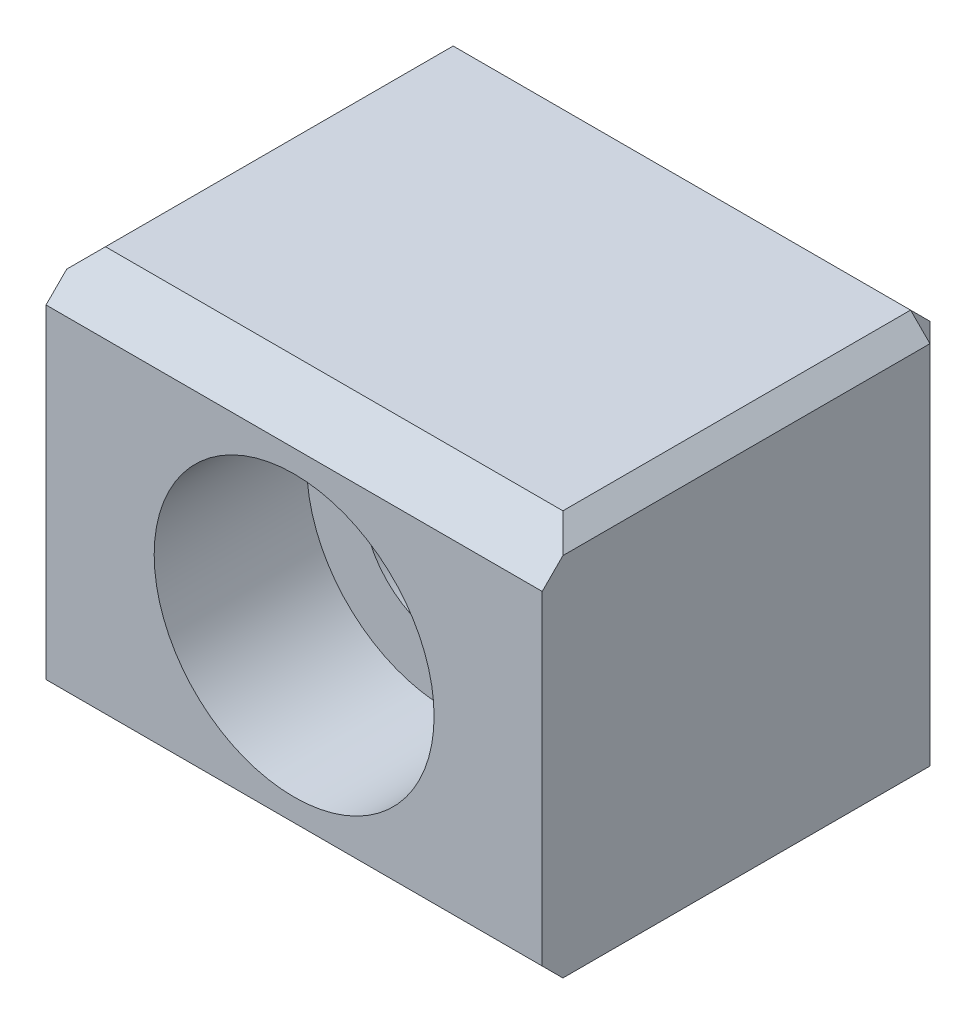
ISO-10303-21;
HEADER;
FILE_DESCRIPTION(('STEP AP214'),'2;1');
FILE_NAME('part.step','',(''),(''),'','','');
FILE_SCHEMA(('AUTOMOTIVE_DESIGN { 1 0 10303 214 1 1 1 1 }'));
ENDSEC;
DATA;
#1=APPLICATION_CONTEXT('core data for automotive mechanical design processes');
#2=APPLICATION_PROTOCOL_DEFINITION('international standard','automotive_design',2000,#1);
#3=PRODUCT_CONTEXT('',#1,'mechanical');
#4=PRODUCT('Part','Part','',(#3));
#5=PRODUCT_RELATED_PRODUCT_CATEGORY('part','',(#4));
#6=PRODUCT_DEFINITION_FORMATION('','',#4);
#7=PRODUCT_DEFINITION_CONTEXT('part definition',#1,'design');
#8=PRODUCT_DEFINITION('design','',#6,#7);
#9=PRODUCT_DEFINITION_SHAPE('','',#8);
#10=(LENGTH_UNIT() NAMED_UNIT(*) SI_UNIT(.MILLI.,.METRE.));
#11=(NAMED_UNIT(*) PLANE_ANGLE_UNIT() SI_UNIT($,.RADIAN.));
#12=(NAMED_UNIT(*) SI_UNIT($,.STERADIAN.) SOLID_ANGLE_UNIT());
#13=UNCERTAINTY_MEASURE_WITH_UNIT(LENGTH_MEASURE(1.E-05),#10,'distance_accuracy_value','');
#14=(GEOMETRIC_REPRESENTATION_CONTEXT(3) GLOBAL_UNCERTAINTY_ASSIGNED_CONTEXT((#13)) GLOBAL_UNIT_ASSIGNED_CONTEXT((#10,
#11,#12)) REPRESENTATION_CONTEXT('',''));
#15=CARTESIAN_POINT('',(0.,0.,0.));
#16=DIRECTION('',(0.,0.,1.));
#17=DIRECTION('',(1.,0.,0.));
#18=AXIS2_PLACEMENT_3D('',#15,#16,#17);
#19=CARTESIAN_POINT('',(-9.75,7.95,-8.));
#20=DIRECTION('',(1.,0.,0.));
#21=DIRECTION('',(0.,0.,-1.));
#22=AXIS2_PLACEMENT_3D('',#19,#20,#21);
#23=PLANE('',#22);
#24=DIRECTION('',(0.,0.,1.));
#25=VECTOR('',#24,1.);
#26=CARTESIAN_POINT('',(-9.75,-7.188,-8.));
#27=LINE('',#26,#25);
#28=CARTESIAN_POINT('',(-9.75,-7.188,-7.238));
#29=VERTEX_POINT('',#28);
#30=CARTESIAN_POINT('',(-9.75,-7.188,7.18719999999999));
#31=VERTEX_POINT('',#30);
#32=EDGE_CURVE('E208',#29,#31,#27,.T.);
#33=ORIENTED_EDGE('',*,*,#32,.T.);
#34=DIRECTION('',(0.,-0.707106781186547,-0.707106781186548));
#35=VECTOR('',#34,1.);
#36=CARTESIAN_POINT('',(-9.75,-6.3752,8.));
#37=LINE('',#36,#35);
#38=CARTESIAN_POINT('',(-9.75,-6.37519999999999,8.));
#39=VERTEX_POINT('',#38);
#40=EDGE_CURVE('E192',#31,#39,#37,.F.);
#41=ORIENTED_EDGE('',*,*,#40,.T.);
#42=DIRECTION('',(0.,-1.,0.));
#43=VECTOR('',#42,1.);
#44=CARTESIAN_POINT('',(-9.75,7.95,8.));
#45=LINE('',#44,#43);
#46=CARTESIAN_POINT('',(-9.75,6.37519999999999,8.));
#47=VERTEX_POINT('',#46);
#48=EDGE_CURVE('E146',#47,#39,#45,.T.);
#49=ORIENTED_EDGE('',*,*,#48,.F.);
#50=DIRECTION('',(0.,0.707106781186548,-0.707106781186547));
#51=VECTOR('',#50,1.);
#52=CARTESIAN_POINT('',(-9.75,7.95,6.4252));
#53=LINE('',#52,#51);
#54=CARTESIAN_POINT('',(-9.75,7.188,7.18719999999999));
#55=VERTEX_POINT('',#54);
#56=EDGE_CURVE('E190',#47,#55,#53,.T.);
#57=ORIENTED_EDGE('',*,*,#56,.T.);
#58=DIRECTION('',(0.,0.,-1.));
#59=VECTOR('',#58,1.);
#60=CARTESIAN_POINT('',(-9.75,7.188,-8.));
#61=LINE('',#60,#59);
#62=CARTESIAN_POINT('',(-9.75,7.188,-7.238));
#63=VERTEX_POINT('',#62);
#64=EDGE_CURVE('E236',#55,#63,#61,.T.);
#65=ORIENTED_EDGE('',*,*,#64,.T.);
#66=DIRECTION('',(0.,-1.,0.));
#67=VECTOR('',#66,1.);
#68=CARTESIAN_POINT('',(-9.75,7.95,-7.238));
#69=LINE('',#68,#67);
#70=EDGE_CURVE('E157',#63,#29,#69,.T.);
#71=ORIENTED_EDGE('',*,*,#70,.T.);
#72=EDGE_LOOP('',(#33,#41,#49,#57,#65,#71));
#73=FACE_BOUND('',#72,.T.);
#74=ADVANCED_FACE('F34',(#73),#23,.F.);
#75=CARTESIAN_POINT('',(-9.75,7.95,8.));
#76=DIRECTION('',(0.,0.,-1.));
#77=DIRECTION('',(-1.,0.,0.));
#78=AXIS2_PLACEMENT_3D('',#75,#76,#77);
#79=PLANE('',#78);
#80=CARTESIAN_POINT('',(0.,0.,8.));
#81=DIRECTION('',(0.,0.,1.));
#82=DIRECTION('',(1.,0.,0.));
#83=AXIS2_PLACEMENT_3D('',#80,#81,#82);
#84=CIRCLE('',#83,5.5);
#85=CARTESIAN_POINT('',(5.5,0.,8.));
#86=VERTEX_POINT('',#85);
#87=EDGE_CURVE('E222',#86,#86,#84,.T.);
#88=ORIENTED_EDGE('',*,*,#87,.F.);
#89=EDGE_LOOP('',(#88));
#90=FACE_BOUND('',#89,.T.);
#91=ORIENTED_EDGE('',*,*,#48,.T.);
#92=DIRECTION('',(1.,0.,0.));
#93=VECTOR('',#92,1.);
#94=CARTESIAN_POINT('',(-9.75,-6.3752,8.));
#95=LINE('',#94,#93);
#96=CARTESIAN_POINT('',(9.75,-6.37519999999999,8.));
#97=VERTEX_POINT('',#96);
#98=EDGE_CURVE('E176',#39,#97,#95,.T.);
#99=ORIENTED_EDGE('',*,*,#98,.T.);
#100=DIRECTION('',(0.,-1.,0.));
#101=VECTOR('',#100,1.);
#102=CARTESIAN_POINT('',(9.75,7.95,8.));
#103=LINE('',#102,#101);
#104=CARTESIAN_POINT('',(9.75,6.37519999999999,8.));
#105=VERTEX_POINT('',#104);
#106=EDGE_CURVE('E217',#105,#97,#103,.T.);
#107=ORIENTED_EDGE('',*,*,#106,.F.);
#108=DIRECTION('',(-1.,0.,0.));
#109=VECTOR('',#108,1.);
#110=CARTESIAN_POINT('',(-8.988,6.37519999999999,8.));
#111=LINE('',#110,#109);
#112=EDGE_CURVE('E174',#105,#47,#111,.T.);
#113=ORIENTED_EDGE('',*,*,#112,.T.);
#114=EDGE_LOOP('',(#91,#99,#107,#113));
#115=FACE_BOUND('',#114,.T.);
#116=ADVANCED_FACE('F215',(#90,#115),#79,.F.);
#117=CARTESIAN_POINT('',(9.75,7.95,-8.));
#118=DIRECTION('',(-1.,0.,0.));
#119=DIRECTION('',(0.,0.,1.));
#120=AXIS2_PLACEMENT_3D('',#117,#118,#119);
#121=PLANE('',#120);
#122=ORIENTED_EDGE('',*,*,#106,.T.);
#123=DIRECTION('',(0.,0.707106781186547,0.707106781186548));
#124=VECTOR('',#123,1.);
#125=CARTESIAN_POINT('',(9.75,-6.3752,8.));
#126=LINE('',#125,#124);
#127=CARTESIAN_POINT('',(9.75,-7.188,7.18719999999999));
#128=VERTEX_POINT('',#127);
#129=EDGE_CURVE('E182',#97,#128,#126,.F.);
#130=ORIENTED_EDGE('',*,*,#129,.T.);
#131=DIRECTION('',(0.,0.,-1.));
#132=VECTOR('',#131,1.);
#133=CARTESIAN_POINT('',(9.75,-7.188,-8.));
#134=LINE('',#133,#132);
#135=CARTESIAN_POINT('',(9.75,-7.188,-7.238));
#136=VERTEX_POINT('',#135);
#137=EDGE_CURVE('E241',#128,#136,#134,.T.);
#138=ORIENTED_EDGE('',*,*,#137,.T.);
#139=DIRECTION('',(0.,1.,0.));
#140=VECTOR('',#139,1.);
#141=CARTESIAN_POINT('',(9.75,7.95,-7.238));
#142=LINE('',#141,#140);
#143=CARTESIAN_POINT('',(9.75,7.188,-7.238));
#144=VERTEX_POINT('',#143);
#145=EDGE_CURVE('E207',#136,#144,#142,.T.);
#146=ORIENTED_EDGE('',*,*,#145,.T.);
#147=DIRECTION('',(0.,0.,1.));
#148=VECTOR('',#147,1.);
#149=CARTESIAN_POINT('',(9.75,7.188,8.));
#150=LINE('',#149,#148);
#151=CARTESIAN_POINT('',(9.75,7.188,7.1872));
#152=VERTEX_POINT('',#151);
#153=EDGE_CURVE('E201',#144,#152,#150,.T.);
#154=ORIENTED_EDGE('',*,*,#153,.T.);
#155=DIRECTION('',(0.,-0.707106781186548,0.707106781186547));
#156=VECTOR('',#155,1.);
#157=CARTESIAN_POINT('',(9.75,7.95,6.42519999999999));
#158=LINE('',#157,#156);
#159=EDGE_CURVE('E180',#152,#105,#158,.T.);
#160=ORIENTED_EDGE('',*,*,#159,.T.);
#161=EDGE_LOOP('',(#122,#130,#138,#146,#154,#160));
#162=FACE_BOUND('',#161,.T.);
#163=ADVANCED_FACE('F204',(#162),#121,.F.);
#164=CARTESIAN_POINT('',(-9.75,7.95,-8.));
#165=DIRECTION('',(0.,0.,1.));
#166=DIRECTION('',(1.,0.,0.));
#167=AXIS2_PLACEMENT_3D('',#164,#165,#166);
#168=PLANE('',#167);
#169=DIRECTION('',(0.,-1.,0.));
#170=VECTOR('',#169,1.);
#171=CARTESIAN_POINT('',(8.988,7.95,-8.));
#172=LINE('',#171,#170);
#173=CARTESIAN_POINT('',(8.988,7.188,-8.));
#174=VERTEX_POINT('',#173);
#175=CARTESIAN_POINT('',(8.988,-7.188,-8.));
#176=VERTEX_POINT('',#175);
#177=EDGE_CURVE('E134',#174,#176,#172,.T.);
#178=ORIENTED_EDGE('',*,*,#177,.T.);
#179=DIRECTION('',(-1.,0.,0.));
#180=VECTOR('',#179,1.);
#181=CARTESIAN_POINT('',(-9.75,-7.188,-8.));
#182=LINE('',#181,#180);
#183=CARTESIAN_POINT('',(-8.988,-7.188,-8.));
#184=VERTEX_POINT('',#183);
#185=EDGE_CURVE('E130',#176,#184,#182,.T.);
#186=ORIENTED_EDGE('',*,*,#185,.T.);
#187=DIRECTION('',(0.,1.,0.));
#188=VECTOR('',#187,1.);
#189=CARTESIAN_POINT('',(-8.988,7.95,-8.));
#190=LINE('',#189,#188);
#191=CARTESIAN_POINT('',(-8.988,7.188,-8.));
#192=VERTEX_POINT('',#191);
#193=EDGE_CURVE('E123',#184,#192,#190,.T.);
#194=ORIENTED_EDGE('',*,*,#193,.T.);
#195=DIRECTION('',(1.,0.,0.));
#196=VECTOR('',#195,1.);
#197=CARTESIAN_POINT('',(9.75,7.188,-8.));
#198=LINE('',#197,#196);
#199=EDGE_CURVE('E127',#192,#174,#198,.T.);
#200=ORIENTED_EDGE('',*,*,#199,.T.);
#201=EDGE_LOOP('',(#178,#186,#194,#200));
#202=FACE_BOUND('',#201,.T.);
#203=CARTESIAN_POINT('',(0.,0.,-8.));
#204=DIRECTION('',(0.,0.,1.));
#205=DIRECTION('',(1.,0.,0.));
#206=AXIS2_PLACEMENT_3D('',#203,#204,#205);
#207=CIRCLE('',#206,3.3);
#208=CARTESIAN_POINT('',(3.3,0.,-8.));
#209=VERTEX_POINT('',#208);
#210=EDGE_CURVE('E173',#209,#209,#207,.T.);
#211=ORIENTED_EDGE('',*,*,#210,.T.);
#212=EDGE_LOOP('',(#211));
#213=FACE_BOUND('',#212,.T.);
#214=ADVANCED_FACE('F125',(#202,#213),#168,.F.);
#215=CARTESIAN_POINT('',(-9.75,7.95,-8.));
#216=DIRECTION('',(0.,1.,0.));
#217=DIRECTION('',(0.,0.,1.));
#218=AXIS2_PLACEMENT_3D('',#215,#216,#217);
#219=PLANE('',#218);
#220=DIRECTION('',(0.,0.,1.));
#221=VECTOR('',#220,1.);
#222=CARTESIAN_POINT('',(-8.988,7.95,8.));
#223=LINE('',#222,#221);
#224=CARTESIAN_POINT('',(-8.988,7.95,-7.238));
#225=VERTEX_POINT('',#224);
#226=CARTESIAN_POINT('',(-8.988,7.95,6.4252));
#227=VERTEX_POINT('',#226);
#228=EDGE_CURVE('E243',#225,#227,#223,.T.);
#229=ORIENTED_EDGE('',*,*,#228,.T.);
#230=DIRECTION('',(1.,0.,0.));
#231=VECTOR('',#230,1.);
#232=CARTESIAN_POINT('',(8.988,7.95,6.4252));
#233=LINE('',#232,#231);
#234=CARTESIAN_POINT('',(8.988,7.95,6.4252));
#235=VERTEX_POINT('',#234);
#236=EDGE_CURVE('E194',#227,#235,#233,.T.);
#237=ORIENTED_EDGE('',*,*,#236,.T.);
#238=DIRECTION('',(0.,0.,-1.));
#239=VECTOR('',#238,1.);
#240=CARTESIAN_POINT('',(8.988,7.95,-8.));
#241=LINE('',#240,#239);
#242=CARTESIAN_POINT('',(8.988,7.95,-7.238));
#243=VERTEX_POINT('',#242);
#244=EDGE_CURVE('E177',#235,#243,#241,.T.);
#245=ORIENTED_EDGE('',*,*,#244,.T.);
#246=DIRECTION('',(-1.,0.,0.));
#247=VECTOR('',#246,1.);
#248=CARTESIAN_POINT('',(-9.75,7.95,-7.238));
#249=LINE('',#248,#247);
#250=EDGE_CURVE('E245',#243,#225,#249,.T.);
#251=ORIENTED_EDGE('',*,*,#250,.T.);
#252=EDGE_LOOP('',(#229,#237,#245,#251));
#253=FACE_BOUND('',#252,.T.);
#254=ADVANCED_FACE('F346',(#253),#219,.T.);
#255=CARTESIAN_POINT('',(-9.75,-7.95,-8.));
#256=DIRECTION('',(0.,1.,0.));
#257=DIRECTION('',(0.,0.,1.));
#258=AXIS2_PLACEMENT_3D('',#255,#256,#257);
#259=PLANE('',#258);
#260=DIRECTION('',(0.,0.,1.));
#261=VECTOR('',#260,1.);
#262=CARTESIAN_POINT('',(8.98799999999999,-7.95,-8.00000000000001));
#263=LINE('',#262,#261);
#264=CARTESIAN_POINT('',(8.98799999999999,-7.95,-7.238));
#265=VERTEX_POINT('',#264);
#266=CARTESIAN_POINT('',(8.98799999999999,-7.95,6.42519999999999));
#267=VERTEX_POINT('',#266);
#268=EDGE_CURVE('E228',#265,#267,#263,.T.);
#269=ORIENTED_EDGE('',*,*,#268,.T.);
#270=DIRECTION('',(-1.,0.,0.));
#271=VECTOR('',#270,1.);
#272=CARTESIAN_POINT('',(-9.75,-7.95,6.42519999999999));
#273=LINE('',#272,#271);
#274=CARTESIAN_POINT('',(-8.988,-7.95,6.4252));
#275=VERTEX_POINT('',#274);
#276=EDGE_CURVE('E186',#267,#275,#273,.T.);
#277=ORIENTED_EDGE('',*,*,#276,.T.);
#278=DIRECTION('',(0.,0.,-1.));
#279=VECTOR('',#278,1.);
#280=CARTESIAN_POINT('',(-8.988,-7.95,-8.));
#281=LINE('',#280,#279);
#282=CARTESIAN_POINT('',(-8.988,-7.95,-7.238));
#283=VERTEX_POINT('',#282);
#284=EDGE_CURVE('E234',#275,#283,#281,.T.);
#285=ORIENTED_EDGE('',*,*,#284,.T.);
#286=DIRECTION('',(1.,0.,0.));
#287=VECTOR('',#286,1.);
#288=CARTESIAN_POINT('',(-9.75,-7.95,-7.238));
#289=LINE('',#288,#287);
#290=EDGE_CURVE('E231',#283,#265,#289,.T.);
#291=ORIENTED_EDGE('',*,*,#290,.T.);
#292=EDGE_LOOP('',(#269,#277,#285,#291));
#293=FACE_BOUND('',#292,.T.);
#294=ADVANCED_FACE('F274',(#293),#259,.F.);
#295=CARTESIAN_POINT('',(0.,0.,8.));
#296=DIRECTION('',(0.,0.,1.));
#297=DIRECTION('',(1.,0.,0.));
#298=AXIS2_PLACEMENT_3D('',#295,#296,#297);
#299=CYLINDRICAL_SURFACE('',#298,5.5);
#300=CARTESIAN_POINT('',(0.,0.,2.));
#301=DIRECTION('',(0.,0.,1.));
#302=DIRECTION('',(1.,0.,0.));
#303=AXIS2_PLACEMENT_3D('',#300,#301,#302);
#304=CIRCLE('',#303,5.5);
#305=CARTESIAN_POINT('',(5.5,0.,2.));
#306=VERTEX_POINT('',#305);
#307=EDGE_CURVE('E487',#306,#306,#304,.T.);
#308=ORIENTED_EDGE('',*,*,#307,.F.);
#309=EDGE_LOOP('',(#308));
#310=FACE_BOUND('',#309,.T.);
#311=ORIENTED_EDGE('',*,*,#87,.T.);
#312=EDGE_LOOP('',(#311));
#313=FACE_BOUND('',#312,.T.);
#314=ADVANCED_FACE('F337',(#310,#313),#299,.F.);
#315=CARTESIAN_POINT('',(3.3,0.,2.));
#316=DIRECTION('',(0.,0.,-1.));
#317=DIRECTION('',(-1.,0.,0.));
#318=AXIS2_PLACEMENT_3D('',#315,#316,#317);
#319=PLANE('',#318);
#320=CARTESIAN_POINT('',(0.,0.,2.));
#321=DIRECTION('',(0.,0.,1.));
#322=DIRECTION('',(1.,0.,0.));
#323=AXIS2_PLACEMENT_3D('',#320,#321,#322);
#324=CIRCLE('',#323,3.3);
#325=CARTESIAN_POINT('',(3.3,0.,2.));
#326=VERTEX_POINT('',#325);
#327=EDGE_CURVE('E490',#326,#326,#324,.T.);
#328=ORIENTED_EDGE('',*,*,#327,.F.);
#329=EDGE_LOOP('',(#328));
#330=FACE_BOUND('',#329,.T.);
#331=ORIENTED_EDGE('',*,*,#307,.T.);
#332=EDGE_LOOP('',(#331));
#333=FACE_BOUND('',#332,.T.);
#334=ADVANCED_FACE('F331',(#330,#333),#319,.F.);
#335=CARTESIAN_POINT('',(0.,0.,8.));
#336=DIRECTION('',(0.,0.,1.));
#337=DIRECTION('',(1.,0.,0.));
#338=AXIS2_PLACEMENT_3D('',#335,#336,#337);
#339=CYLINDRICAL_SURFACE('',#338,3.3);
#340=ORIENTED_EDGE('',*,*,#210,.F.);
#341=EDGE_LOOP('',(#340));
#342=FACE_BOUND('',#341,.T.);
#343=ORIENTED_EDGE('',*,*,#327,.T.);
#344=EDGE_LOOP('',(#343));
#345=FACE_BOUND('',#344,.T.);
#346=ADVANCED_FACE('F327',(#342,#345),#339,.F.);
#347=CARTESIAN_POINT('',(8.988,7.95,-8.00000000000001));
#348=DIRECTION('',(0.707106781186548,0.707106781186547,0.));
#349=DIRECTION('',(-0.707106781186547,0.707106781186548,0.));
#350=AXIS2_PLACEMENT_3D('',#347,#348,#349);
#351=PLANE('',#350);
#352=ORIENTED_EDGE('',*,*,#244,.F.);
#353=DIRECTION('',(0.577350269189625,-0.577350269189627,0.577350269189625));
#354=VECTOR('',#353,1.);
#355=CARTESIAN_POINT('',(4.17960000000001,12.7584,1.6168));
#356=LINE('',#355,#354);
#357=EDGE_CURVE('E42',#235,#152,#356,.T.);
#358=ORIENTED_EDGE('',*,*,#357,.T.);
#359=ORIENTED_EDGE('',*,*,#153,.F.);
#360=DIRECTION('',(0.707106781186547,-0.707106781186548,0.));
#361=VECTOR('',#360,1.);
#362=CARTESIAN_POINT('',(9.75,7.188,-7.238));
#363=LINE('',#362,#361);
#364=EDGE_CURVE('E170',#243,#144,#363,.T.);
#365=ORIENTED_EDGE('',*,*,#364,.F.);
#366=EDGE_LOOP('',(#352,#358,#359,#365));
#367=FACE_BOUND('',#366,.T.);
#368=ADVANCED_FACE('F199',(#367),#351,.T.);
#369=CARTESIAN_POINT('',(-9.75,7.95,-7.238));
#370=DIRECTION('',(0.,0.707106781186546,-0.707106781186549));
#371=DIRECTION('',(0.,0.707106781186549,0.707106781186546));
#372=AXIS2_PLACEMENT_3D('',#369,#370,#371);
#373=PLANE('',#372);
#374=DIRECTION('',(0.,-0.707106781186549,-0.707106781186546));
#375=VECTOR('',#374,1.);
#376=CARTESIAN_POINT('',(-8.988,7.188,-8.));
#377=LINE('',#376,#375);
#378=EDGE_CURVE('E141',#225,#192,#377,.T.);
#379=ORIENTED_EDGE('',*,*,#378,.F.);
#380=ORIENTED_EDGE('',*,*,#250,.F.);
#381=DIRECTION('',(0.,0.707106781186549,0.707106781186546));
#382=VECTOR('',#381,1.);
#383=CARTESIAN_POINT('',(8.988,7.569,-7.619));
#384=LINE('',#383,#382);
#385=EDGE_CURVE('E144',#174,#243,#384,.T.);
#386=ORIENTED_EDGE('',*,*,#385,.F.);
#387=ORIENTED_EDGE('',*,*,#199,.F.);
#388=EDGE_LOOP('',(#379,#380,#386,#387));
#389=FACE_BOUND('',#388,.T.);
#390=ADVANCED_FACE('F139',(#389),#373,.T.);
#391=CARTESIAN_POINT('',(-8.988,7.95,-8.));
#392=DIRECTION('',(-0.707106781186549,0.707106781186546,0.));
#393=DIRECTION('',(-0.707106781186546,-0.707106781186549,0.));
#394=AXIS2_PLACEMENT_3D('',#391,#392,#393);
#395=PLANE('',#394);
#396=ORIENTED_EDGE('',*,*,#64,.F.);
#397=DIRECTION('',(0.577350269189624,0.577350269189627,-0.577350269189626));
#398=VECTOR('',#397,1.);
#399=CARTESIAN_POINT('',(-4.17960000000001,12.7584,1.6168));
#400=LINE('',#399,#398);
#401=EDGE_CURVE('E11',#55,#227,#400,.T.);
#402=ORIENTED_EDGE('',*,*,#401,.T.);
#403=ORIENTED_EDGE('',*,*,#228,.F.);
#404=DIRECTION('',(0.707106781186546,0.707106781186549,0.));
#405=VECTOR('',#404,1.);
#406=CARTESIAN_POINT('',(-9.369,7.569,-7.238));
#407=LINE('',#406,#405);
#408=EDGE_CURVE('E154',#63,#225,#407,.T.);
#409=ORIENTED_EDGE('',*,*,#408,.F.);
#410=EDGE_LOOP('',(#396,#402,#403,#409));
#411=FACE_BOUND('',#410,.T.);
#412=ADVANCED_FACE('F321',(#411),#395,.T.);
#413=CARTESIAN_POINT('',(9.75,7.188,-7.238));
#414=DIRECTION('',(0.577350269189628,0.577350269189624,-0.577350269189626));
#415=DIRECTION('',(-0.707106781186547,0.,-0.707106781186548));
#416=AXIS2_PLACEMENT_3D('',#413,#414,#415);
#417=PLANE('',#416);
#418=ORIENTED_EDGE('',*,*,#385,.T.);
#419=ORIENTED_EDGE('',*,*,#364,.T.);
#420=DIRECTION('',(0.707106781186547,0.,0.707106781186548));
#421=VECTOR('',#420,1.);
#422=CARTESIAN_POINT('',(9.75,7.188,-7.238));
#423=LINE('',#422,#421);
#424=EDGE_CURVE('E158',#174,#144,#423,.T.);
#425=ORIENTED_EDGE('',*,*,#424,.F.);
#426=EDGE_LOOP('',(#418,#419,#425));
#427=FACE_BOUND('',#426,.T.);
#428=ADVANCED_FACE('F318',(#427),#417,.T.);
#429=CARTESIAN_POINT('',(-8.988,7.188,-8.));
#430=DIRECTION('',(-0.577350269189628,0.577350269189623,-0.577350269189626));
#431=DIRECTION('',(-0.707106781186546,0.,0.707106781186549));
#432=AXIS2_PLACEMENT_3D('',#429,#430,#431);
#433=PLANE('',#432);
#434=ORIENTED_EDGE('',*,*,#408,.T.);
#435=ORIENTED_EDGE('',*,*,#378,.T.);
#436=DIRECTION('',(0.707106781186546,0.,-0.707106781186549));
#437=VECTOR('',#436,1.);
#438=CARTESIAN_POINT('',(-8.988,7.188,-8.));
#439=LINE('',#438,#437);
#440=EDGE_CURVE('E151',#63,#192,#439,.T.);
#441=ORIENTED_EDGE('',*,*,#440,.F.);
#442=EDGE_LOOP('',(#434,#435,#441));
#443=FACE_BOUND('',#442,.T.);
#444=ADVANCED_FACE('F150',(#443),#433,.T.);
#445=CARTESIAN_POINT('',(9.75,-7.188,-8.));
#446=DIRECTION('',(-0.707106781186545,0.70710678118655,0.));
#447=DIRECTION('',(-0.70710678118655,-0.707106781186545,0.));
#448=AXIS2_PLACEMENT_3D('',#445,#446,#447);
#449=PLANE('',#448);
#450=ORIENTED_EDGE('',*,*,#137,.F.);
#451=DIRECTION('',(-0.577350269189628,-0.577350269189624,-0.577350269189625));
#452=VECTOR('',#451,1.);
#453=CARTESIAN_POINT('',(4.68759999999999,-12.2504,2.1248));
#454=LINE('',#453,#452);
#455=EDGE_CURVE('E184',#128,#267,#454,.T.);
#456=ORIENTED_EDGE('',*,*,#455,.T.);
#457=ORIENTED_EDGE('',*,*,#268,.F.);
#458=DIRECTION('',(0.70710678118655,0.707106781186545,0.));
#459=VECTOR('',#458,1.);
#460=CARTESIAN_POINT('',(8.98799999999999,-7.95,-7.238));
#461=LINE('',#460,#459);
#462=EDGE_CURVE('E159',#136,#265,#461,.F.);
#463=ORIENTED_EDGE('',*,*,#462,.F.);
#464=EDGE_LOOP('',(#450,#456,#457,#463));
#465=FACE_BOUND('',#464,.T.);
#466=ADVANCED_FACE('F269',(#465),#449,.F.);
#467=CARTESIAN_POINT('',(8.988,7.95,-8.));
#468=DIRECTION('',(-0.707106781186548,0.,0.707106781186547));
#469=DIRECTION('',(0.707106781186547,0.,0.707106781186548));
#470=AXIS2_PLACEMENT_3D('',#467,#468,#469);
#471=PLANE('',#470);
#472=ORIENTED_EDGE('',*,*,#424,.T.);
#473=ORIENTED_EDGE('',*,*,#145,.F.);
#474=DIRECTION('',(-0.707106781186547,0.,-0.707106781186548));
#475=VECTOR('',#474,1.);
#476=CARTESIAN_POINT('',(9.369,-7.188,-7.619));
#477=LINE('',#476,#475);
#478=EDGE_CURVE('E164',#176,#136,#477,.F.);
#479=ORIENTED_EDGE('',*,*,#478,.F.);
#480=ORIENTED_EDGE('',*,*,#177,.F.);
#481=EDGE_LOOP('',(#472,#473,#479,#480));
#482=FACE_BOUND('',#481,.T.);
#483=ADVANCED_FACE('F266',(#482),#471,.F.);
#484=CARTESIAN_POINT('',(-9.75,7.95,-7.238));
#485=DIRECTION('',(0.707106781186549,0.,0.707106781186546));
#486=DIRECTION('',(0.707106781186546,0.,-0.707106781186549));
#487=AXIS2_PLACEMENT_3D('',#484,#485,#486);
#488=PLANE('',#487);
#489=ORIENTED_EDGE('',*,*,#440,.T.);
#490=ORIENTED_EDGE('',*,*,#193,.F.);
#491=DIRECTION('',(-0.707106781186546,0.,0.707106781186549));
#492=VECTOR('',#491,1.);
#493=CARTESIAN_POINT('',(-8.988,-7.188,-8.));
#494=LINE('',#493,#492);
#495=EDGE_CURVE('E255',#29,#184,#494,.F.);
#496=ORIENTED_EDGE('',*,*,#495,.F.);
#497=ORIENTED_EDGE('',*,*,#70,.F.);
#498=EDGE_LOOP('',(#489,#490,#496,#497));
#499=FACE_BOUND('',#498,.T.);
#500=ADVANCED_FACE('F156',(#499),#488,.F.);
#501=CARTESIAN_POINT('',(-9.75,-7.188,-8.));
#502=DIRECTION('',(0.707106781186549,0.707106781186546,0.));
#503=DIRECTION('',(-0.707106781186546,0.707106781186549,0.));
#504=AXIS2_PLACEMENT_3D('',#501,#502,#503);
#505=PLANE('',#504);
#506=ORIENTED_EDGE('',*,*,#284,.F.);
#507=DIRECTION('',(-0.577350269189624,0.577350269189626,0.577350269189627));
#508=VECTOR('',#507,1.);
#509=CARTESIAN_POINT('',(-4.68760000000001,-12.2504,2.12479999999997));
#510=LINE('',#509,#508);
#511=EDGE_CURVE('E188',#275,#31,#510,.T.);
#512=ORIENTED_EDGE('',*,*,#511,.T.);
#513=ORIENTED_EDGE('',*,*,#32,.F.);
#514=DIRECTION('',(0.707106781186546,-0.707106781186549,0.));
#515=VECTOR('',#514,1.);
#516=CARTESIAN_POINT('',(-9.369,-7.569,-7.238));
#517=LINE('',#516,#515);
#518=EDGE_CURVE('E252',#283,#29,#517,.F.);
#519=ORIENTED_EDGE('',*,*,#518,.F.);
#520=EDGE_LOOP('',(#506,#512,#513,#519));
#521=FACE_BOUND('',#520,.T.);
#522=ADVANCED_FACE('F284',(#521),#505,.F.);
#523=CARTESIAN_POINT('',(8.98799999999999,-7.95,-7.238));
#524=DIRECTION('',(0.577350269189625,-0.577350269189629,-0.577350269189624));
#525=DIRECTION('',(0.70710678118655,0.707106781186545,0.));
#526=AXIS2_PLACEMENT_3D('',#523,#524,#525);
#527=PLANE('',#526);
#528=ORIENTED_EDGE('',*,*,#478,.T.);
#529=ORIENTED_EDGE('',*,*,#462,.T.);
#530=DIRECTION('',(0.,-0.707106781186546,0.707106781186549));
#531=VECTOR('',#530,1.);
#532=CARTESIAN_POINT('',(8.98799999999999,-7.95,-7.238));
#533=LINE('',#532,#531);
#534=EDGE_CURVE('E250',#176,#265,#533,.T.);
#535=ORIENTED_EDGE('',*,*,#534,.F.);
#536=EDGE_LOOP('',(#528,#529,#535));
#537=FACE_BOUND('',#536,.T.);
#538=ADVANCED_FACE('F261',(#537),#527,.T.);
#539=CARTESIAN_POINT('',(-8.988,-7.188,-8.));
#540=DIRECTION('',(-0.577350269189628,-0.577350269189626,-0.577350269189623));
#541=DIRECTION('',(0.707106781186546,-0.707106781186549,0.));
#542=AXIS2_PLACEMENT_3D('',#539,#540,#541);
#543=PLANE('',#542);
#544=ORIENTED_EDGE('',*,*,#518,.T.);
#545=ORIENTED_EDGE('',*,*,#495,.T.);
#546=DIRECTION('',(0.,0.707106781186546,-0.707106781186549));
#547=VECTOR('',#546,1.);
#548=CARTESIAN_POINT('',(-8.988,-7.188,-8.));
#549=LINE('',#548,#547);
#550=EDGE_CURVE('E248',#283,#184,#549,.T.);
#551=ORIENTED_EDGE('',*,*,#550,.F.);
#552=EDGE_LOOP('',(#544,#545,#551));
#553=FACE_BOUND('',#552,.T.);
#554=ADVANCED_FACE('F281',(#553),#543,.T.);
#555=CARTESIAN_POINT('',(-9.75,-7.188,-8.));
#556=DIRECTION('',(0.,0.707106781186549,0.707106781186546));
#557=DIRECTION('',(0.,-0.707106781186546,0.707106781186549));
#558=AXIS2_PLACEMENT_3D('',#555,#556,#557);
#559=PLANE('',#558);
#560=ORIENTED_EDGE('',*,*,#534,.T.);
#561=ORIENTED_EDGE('',*,*,#290,.F.);
#562=ORIENTED_EDGE('',*,*,#550,.T.);
#563=ORIENTED_EDGE('',*,*,#185,.F.);
#564=EDGE_LOOP('',(#560,#561,#562,#563));
#565=FACE_BOUND('',#564,.T.);
#566=ADVANCED_FACE('F279',(#565),#559,.F.);
#567=CARTESIAN_POINT('',(-9.75,-6.3752,8.));
#568=DIRECTION('',(0.,0.707106781186548,-0.707106781186547));
#569=DIRECTION('',(0.,0.707106781186547,0.707106781186548));
#570=AXIS2_PLACEMENT_3D('',#567,#568,#569);
#571=PLANE('',#570);
#572=ORIENTED_EDGE('',*,*,#511,.F.);
#573=ORIENTED_EDGE('',*,*,#276,.F.);
#574=ORIENTED_EDGE('',*,*,#455,.F.);
#575=ORIENTED_EDGE('',*,*,#129,.F.);
#576=ORIENTED_EDGE('',*,*,#98,.F.);
#577=ORIENTED_EDGE('',*,*,#40,.F.);
#578=EDGE_LOOP('',(#572,#573,#574,#575,#576,#577));
#579=FACE_BOUND('',#578,.T.);
#580=ADVANCED_FACE('F287',(#579),#571,.F.);
#581=CARTESIAN_POINT('',(-9.75,7.95,6.4252));
#582=DIRECTION('',(0.,0.707106781186547,0.707106781186548));
#583=DIRECTION('',(0.,-0.707106781186548,0.707106781186547));
#584=AXIS2_PLACEMENT_3D('',#581,#582,#583);
#585=PLANE('',#584);
#586=ORIENTED_EDGE('',*,*,#56,.F.);
#587=ORIENTED_EDGE('',*,*,#112,.F.);
#588=ORIENTED_EDGE('',*,*,#159,.F.);
#589=ORIENTED_EDGE('',*,*,#357,.F.);
#590=ORIENTED_EDGE('',*,*,#236,.F.);
#591=ORIENTED_EDGE('',*,*,#401,.F.);
#592=EDGE_LOOP('',(#586,#587,#588,#589,#590,#591));
#593=FACE_BOUND('',#592,.T.);
#594=ADVANCED_FACE('F36',(#593),#585,.T.);
#595=CLOSED_SHELL('',(#74,#116,#163,#214,#254,#294,#314,#334,#346,#368,#390,#412,#428,#444,#466,
#483,#500,#522,#538,#554,#566,#580,#594));
#596=MANIFOLD_SOLID_BREP('B2',#595);
#597=ADVANCED_BREP_SHAPE_REPRESENTATION('',(#18,#596),#14);
#598=SHAPE_DEFINITION_REPRESENTATION(#9,#597);
ENDSEC;
END-ISO-10303-21;
